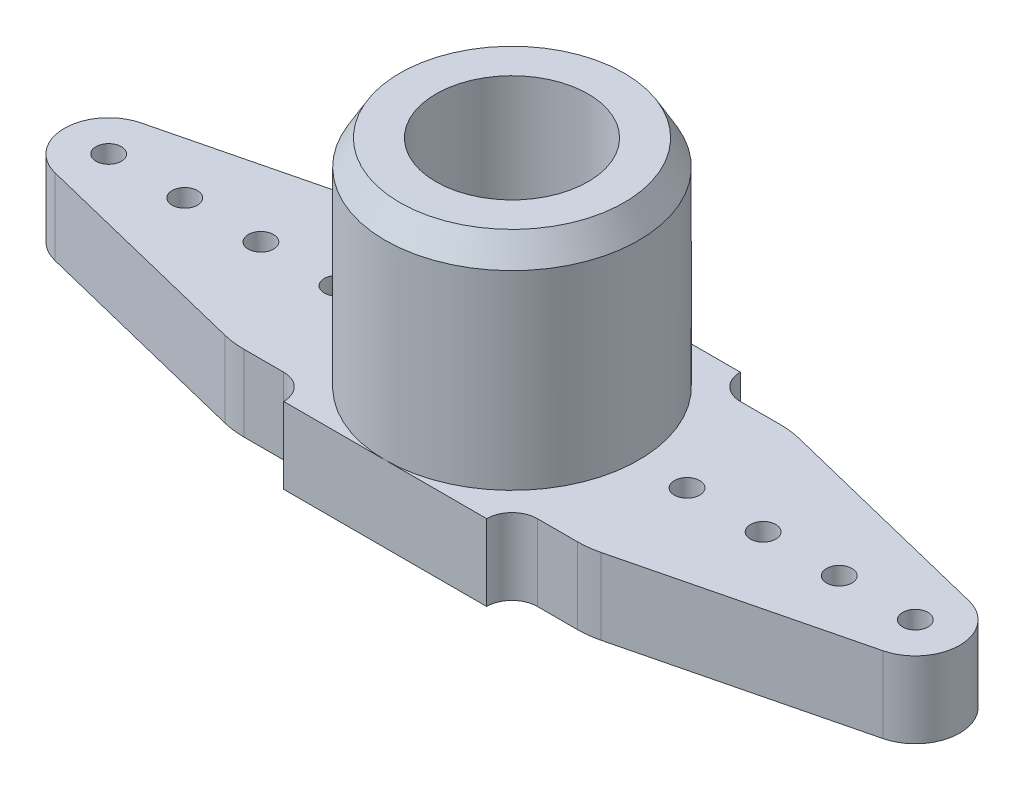
ISO-10303-21;
HEADER;
FILE_DESCRIPTION(('STEP AP214'),'2;1');
FILE_NAME('part.step','',(''),(''),'','','');
FILE_SCHEMA(('AUTOMOTIVE_DESIGN { 1 0 10303 214 1 1 1 1 }'));
ENDSEC;
DATA;
#1=APPLICATION_CONTEXT('core data for automotive mechanical design processes');
#2=APPLICATION_PROTOCOL_DEFINITION('international standard','automotive_design',2000,#1);
#3=PRODUCT_CONTEXT('',#1,'mechanical');
#4=PRODUCT('Part','Part','',(#3));
#5=PRODUCT_RELATED_PRODUCT_CATEGORY('part','',(#4));
#6=PRODUCT_DEFINITION_FORMATION('','',#4);
#7=PRODUCT_DEFINITION_CONTEXT('part definition',#1,'design');
#8=PRODUCT_DEFINITION('design','',#6,#7);
#9=PRODUCT_DEFINITION_SHAPE('','',#8);
#10=(LENGTH_UNIT() NAMED_UNIT(*) SI_UNIT(.MILLI.,.METRE.));
#11=(NAMED_UNIT(*) PLANE_ANGLE_UNIT() SI_UNIT($,.RADIAN.));
#12=(NAMED_UNIT(*) SI_UNIT($,.STERADIAN.) SOLID_ANGLE_UNIT());
#13=UNCERTAINTY_MEASURE_WITH_UNIT(LENGTH_MEASURE(1.E-05),#10,'distance_accuracy_value','');
#14=(GEOMETRIC_REPRESENTATION_CONTEXT(3) GLOBAL_UNCERTAINTY_ASSIGNED_CONTEXT((#13)) GLOBAL_UNIT_ASSIGNED_CONTEXT((#10,
#11,#12)) REPRESENTATION_CONTEXT('',''));
#15=CARTESIAN_POINT('',(0.,0.,0.));
#16=DIRECTION('',(0.,0.,1.));
#17=DIRECTION('',(1.,0.,0.));
#18=AXIS2_PLACEMENT_3D('',#15,#16,#17);
#19=CARTESIAN_POINT('',(0.,3.,0.));
#20=DIRECTION('',(0.,1.,0.));
#21=DIRECTION('',(0.,0.,1.));
#22=AXIS2_PLACEMENT_3D('',#19,#20,#21);
#23=PLANE('',#22);
#24=DIRECTION('',(1.,0.,0.));
#25=VECTOR('',#24,1.);
#26=CARTESIAN_POINT('',(0.,3.,-4.99999999999992));
#27=LINE('',#26,#25);
#28=CARTESIAN_POINT('',(-3.99999999999998,3.,-4.99999999999991));
#29=VERTEX_POINT('',#28);
#30=CARTESIAN_POINT('',(0.,3.,-4.99999999999992));
#31=VERTEX_POINT('',#30);
#32=EDGE_CURVE('E907',#29,#31,#27,.T.);
#33=ORIENTED_EDGE('',*,*,#32,.F.);
#34=CARTESIAN_POINT('',(-5.,3.,-5.00000000000002));
#35=DIRECTION('',(0.,1.,0.));
#36=DIRECTION('',(0.,0.,1.));
#37=AXIS2_PLACEMENT_3D('',#34,#35,#36);
#38=CIRCLE('',#37,1.);
#39=CARTESIAN_POINT('',(-5.00000000000001,3.,-4.00000000000002));
#40=VERTEX_POINT('',#39);
#41=EDGE_CURVE('E204',#29,#40,#38,.F.);
#42=ORIENTED_EDGE('',*,*,#41,.T.);
#43=DIRECTION('',(-1.,0.,0.));
#44=VECTOR('',#43,1.);
#45=CARTESIAN_POINT('',(0.,3.,-4.));
#46=LINE('',#45,#44);
#47=CARTESIAN_POINT('',(-6.57429368146865,3.,-4.00000000000007));
#48=VERTEX_POINT('',#47);
#49=EDGE_CURVE('E327',#40,#48,#46,.T.);
#50=ORIENTED_EDGE('',*,*,#49,.T.);
#51=CARTESIAN_POINT('',(-6.57429368146869,3.,-0.500000000000069));
#52=DIRECTION('',(0.,1.,0.));
#53=DIRECTION('',(-1.,0.,0.));
#54=AXIS2_PLACEMENT_3D('',#51,#52,#53);
#55=CIRCLE('',#54,3.5);
#56=CARTESIAN_POINT('',(-7.41329418820799,3.,-3.89795205229439));
#57=VERTEX_POINT('',#56);
#58=EDGE_CURVE('E233',#48,#57,#55,.T.);
#59=ORIENTED_EDGE('',*,*,#58,.T.);
#60=DIRECTION('',(-0.970843443512664,0.,0.239714430496943));
#61=VECTOR('',#60,1.);
#62=CARTESIAN_POINT('',(-16.319147094104,3.,-1.69897602614733));
#63=LINE('',#62,#61);
#64=CARTESIAN_POINT('',(-16.319147094104,3.,-1.69897602614733));
#65=VERTEX_POINT('',#64);
#66=EDGE_CURVE('E878',#57,#65,#63,.T.);
#67=ORIENTED_EDGE('',*,*,#66,.T.);
#68=CARTESIAN_POINT('',(-15.8996468407343,3.,-1.6653996071586E-13));
#69=DIRECTION('',(0.,1.,0.));
#70=DIRECTION('',(-1.,0.,0.));
#71=AXIS2_PLACEMENT_3D('',#68,#69,#70);
#72=CIRCLE('',#71,1.75);
#73=CARTESIAN_POINT('',(-16.319147094104,3.,1.69897602614699));
#74=VERTEX_POINT('',#73);
#75=EDGE_CURVE('E868',#65,#74,#72,.T.);
#76=ORIENTED_EDGE('',*,*,#75,.T.);
#77=DIRECTION('',(0.970843443512658,0.,0.239714430496963));
#78=VECTOR('',#77,1.);
#79=CARTESIAN_POINT('',(-7.41329418820807,3.,3.89795205229424));
#80=LINE('',#79,#78);
#81=CARTESIAN_POINT('',(-7.41329418820807,3.,3.89795205229424));
#82=VERTEX_POINT('',#81);
#83=EDGE_CURVE('E874',#74,#82,#80,.T.);
#84=ORIENTED_EDGE('',*,*,#83,.T.);
#85=CARTESIAN_POINT('',(-6.5742936814687,3.,0.499999999999931));
#86=DIRECTION('',(0.,1.,0.));
#87=DIRECTION('',(-1.,0.,0.));
#88=AXIS2_PLACEMENT_3D('',#85,#86,#87);
#89=CIRCLE('',#88,3.5);
#90=CARTESIAN_POINT('',(-6.57429368146873,3.,3.99999999999993));
#91=VERTEX_POINT('',#90);
#92=EDGE_CURVE('E873',#82,#91,#89,.T.);
#93=ORIENTED_EDGE('',*,*,#92,.T.);
#94=DIRECTION('',(1.,0.,0.));
#95=VECTOR('',#94,1.);
#96=CARTESIAN_POINT('',(0.,3.,4.));
#97=LINE('',#96,#95);
#98=CARTESIAN_POINT('',(-4.99999999999999,3.,3.99999999999995));
#99=VERTEX_POINT('',#98);
#100=EDGE_CURVE('E346',#91,#99,#97,.T.);
#101=ORIENTED_EDGE('',*,*,#100,.T.);
#102=CARTESIAN_POINT('',(-5.,3.,4.99999999999995));
#103=DIRECTION('',(0.,1.,0.));
#104=DIRECTION('',(0.,0.,1.));
#105=AXIS2_PLACEMENT_3D('',#102,#103,#104);
#106=CIRCLE('',#105,1.);
#107=CARTESIAN_POINT('',(-4.,3.,4.99999999999995));
#108=VERTEX_POINT('',#107);
#109=EDGE_CURVE('E210',#99,#108,#106,.F.);
#110=ORIENTED_EDGE('',*,*,#109,.T.);
#111=DIRECTION('',(-1.,0.,0.));
#112=VECTOR('',#111,1.);
#113=CARTESIAN_POINT('',(0.,3.,4.99999999999998));
#114=LINE('',#113,#112);
#115=CARTESIAN_POINT('',(0.,3.,4.99999999999998));
#116=VERTEX_POINT('',#115);
#117=EDGE_CURVE('E258',#116,#108,#114,.T.);
#118=ORIENTED_EDGE('',*,*,#117,.F.);
#119=CARTESIAN_POINT('',(0.,3.,0.));
#120=DIRECTION('',(0.,1.,0.));
#121=DIRECTION('',(0.,0.,1.));
#122=AXIS2_PLACEMENT_3D('',#119,#120,#121);
#123=CIRCLE('',#122,5.);
#124=EDGE_CURVE('E902',#31,#116,#123,.T.);
#125=ORIENTED_EDGE('',*,*,#124,.F.);
#126=EDGE_LOOP('',(#33,#42,#50,#59,#67,#76,#84,#93,#101,#110,#118,#125));
#127=FACE_BOUND('',#126,.T.);
#128=CARTESIAN_POINT('',(-9.89964684073435,3.,-1.6653996071586E-13));
#129=DIRECTION('',(0.,1.,0.));
#130=DIRECTION('',(1.,0.,0.));
#131=AXIS2_PLACEMENT_3D('',#128,#129,#130);
#132=CIRCLE('',#131,0.500000000000001);
#133=CARTESIAN_POINT('',(-9.39964684073435,3.,-1.61302738707596E-13));
#134=VERTEX_POINT('',#133);
#135=EDGE_CURVE('E887',#134,#134,#132,.T.);
#136=ORIENTED_EDGE('',*,*,#135,.F.);
#137=EDGE_LOOP('',(#136));
#138=FACE_BOUND('',#137,.T.);
#139=CARTESIAN_POINT('',(-15.8996468407343,3.,-1.6653996071586E-13));
#140=DIRECTION('',(0.,1.,0.));
#141=DIRECTION('',(1.,0.,0.));
#142=AXIS2_PLACEMENT_3D('',#139,#140,#141);
#143=CIRCLE('',#142,0.500000000000001);
#144=CARTESIAN_POINT('',(-15.3996468407343,3.,-1.61302738707596E-13));
#145=VERTEX_POINT('',#144);
#146=EDGE_CURVE('E338',#145,#145,#143,.T.);
#147=ORIENTED_EDGE('',*,*,#146,.F.);
#148=EDGE_LOOP('',(#147));
#149=FACE_BOUND('',#148,.T.);
#150=CARTESIAN_POINT('',(-12.8996468407343,3.,-1.6653996071586E-13));
#151=DIRECTION('',(0.,1.,0.));
#152=DIRECTION('',(1.,0.,0.));
#153=AXIS2_PLACEMENT_3D('',#150,#151,#152);
#154=CIRCLE('',#153,0.500000000000001);
#155=CARTESIAN_POINT('',(-12.3996468407343,3.,-1.61302738707596E-13));
#156=VERTEX_POINT('',#155);
#157=EDGE_CURVE('E882',#156,#156,#154,.T.);
#158=ORIENTED_EDGE('',*,*,#157,.F.);
#159=EDGE_LOOP('',(#158));
#160=FACE_BOUND('',#159,.T.);
#161=CARTESIAN_POINT('',(-6.89964684073435,3.,-1.6653996071586E-13));
#162=DIRECTION('',(0.,1.,0.));
#163=DIRECTION('',(1.,0.,0.));
#164=AXIS2_PLACEMENT_3D('',#161,#162,#163);
#165=CIRCLE('',#164,0.500000000000001);
#166=CARTESIAN_POINT('',(-6.39964684073434,3.,-1.61302738707596E-13));
#167=VERTEX_POINT('',#166);
#168=EDGE_CURVE('E893',#167,#167,#165,.T.);
#169=ORIENTED_EDGE('',*,*,#168,.F.);
#170=EDGE_LOOP('',(#169));
#171=FACE_BOUND('',#170,.T.);
#172=ADVANCED_FACE('F34',(#127,#138,#149,#160,#171),#23,.T.);
#173=CARTESIAN_POINT('',(4.,3.,-4.99999999999994));
#174=VERTEX_POINT('',#173);
#175=EDGE_CURVE('E182',#31,#174,#27,.T.);
#176=ORIENTED_EDGE('',*,*,#175,.F.);
#177=EDGE_CURVE('E257',#116,#31,#123,.T.);
#178=ORIENTED_EDGE('',*,*,#177,.F.);
#179=CARTESIAN_POINT('',(4.,3.,5.00000000000002));
#180=VERTEX_POINT('',#179);
#181=EDGE_CURVE('E249',#180,#116,#114,.T.);
#182=ORIENTED_EDGE('',*,*,#181,.F.);
#183=CARTESIAN_POINT('',(5.,3.,5.00000000000002));
#184=DIRECTION('',(0.,1.,0.));
#185=DIRECTION('',(0.,0.,1.));
#186=AXIS2_PLACEMENT_3D('',#183,#184,#185);
#187=CIRCLE('',#186,1.);
#188=CARTESIAN_POINT('',(5.00000000000001,3.,4.00000000000002));
#189=VERTEX_POINT('',#188);
#190=EDGE_CURVE('E42',#180,#189,#187,.F.);
#191=ORIENTED_EDGE('',*,*,#190,.T.);
#192=DIRECTION('',(1.,0.,0.));
#193=VECTOR('',#192,1.);
#194=CARTESIAN_POINT('',(6.57429368146868,3.,4.00000000000002));
#195=LINE('',#194,#193);
#196=CARTESIAN_POINT('',(6.57429368146868,3.,4.00000000000002));
#197=VERTEX_POINT('',#196);
#198=EDGE_CURVE('E287',#189,#197,#195,.T.);
#199=ORIENTED_EDGE('',*,*,#198,.T.);
#200=CARTESIAN_POINT('',(6.57429368146869,3.,0.500000000000023));
#201=DIRECTION('',(0.,1.,0.));
#202=DIRECTION('',(1.,0.,0.));
#203=AXIS2_PLACEMENT_3D('',#200,#201,#202);
#204=CIRCLE('',#203,3.5);
#205=CARTESIAN_POINT('',(7.41329418820801,3.,3.89795205229434));
#206=VERTEX_POINT('',#205);
#207=EDGE_CURVE('E388',#197,#206,#204,.T.);
#208=ORIENTED_EDGE('',*,*,#207,.T.);
#209=DIRECTION('',(0.970843443512662,0.,-0.23971443049695));
#210=VECTOR('',#209,1.);
#211=CARTESIAN_POINT('',(16.319147094104,3.,1.69897602614721));
#212=LINE('',#211,#210);
#213=CARTESIAN_POINT('',(16.319147094104,3.,1.69897602614721));
#214=VERTEX_POINT('',#213);
#215=EDGE_CURVE('E390',#206,#214,#212,.T.);
#216=ORIENTED_EDGE('',*,*,#215,.T.);
#217=CARTESIAN_POINT('',(15.8996468407343,3.,0.));
#218=DIRECTION('',(0.,1.,0.));
#219=DIRECTION('',(1.,0.,0.));
#220=AXIS2_PLACEMENT_3D('',#217,#218,#219);
#221=CIRCLE('',#220,1.75);
#222=CARTESIAN_POINT('',(16.319147094104,3.,-1.6989760261471));
#223=VERTEX_POINT('',#222);
#224=EDGE_CURVE('E392',#214,#223,#221,.T.);
#225=ORIENTED_EDGE('',*,*,#224,.T.);
#226=DIRECTION('',(-0.97084344351266,0.,-0.239714430496957));
#227=VECTOR('',#226,1.);
#228=CARTESIAN_POINT('',(7.41329418820804,3.,-3.89795205229429));
#229=LINE('',#228,#227);
#230=CARTESIAN_POINT('',(7.41329418820804,3.,-3.89795205229429));
#231=VERTEX_POINT('',#230);
#232=EDGE_CURVE('E394',#223,#231,#229,.T.);
#233=ORIENTED_EDGE('',*,*,#232,.T.);
#234=CARTESIAN_POINT('',(6.57429368146869,3.,-0.499999999999977));
#235=DIRECTION('',(0.,1.,0.));
#236=DIRECTION('',(1.,0.,0.));
#237=AXIS2_PLACEMENT_3D('',#234,#235,#236);
#238=CIRCLE('',#237,3.5);
#239=CARTESIAN_POINT('',(6.5742936814687,3.,-3.99999999999998));
#240=VERTEX_POINT('',#239);
#241=EDGE_CURVE('E395',#231,#240,#238,.T.);
#242=ORIENTED_EDGE('',*,*,#241,.T.);
#243=CARTESIAN_POINT('',(5.,3.,-3.99999999999998));
#244=VERTEX_POINT('',#243);
#245=EDGE_CURVE('E274',#240,#244,#46,.T.);
#246=ORIENTED_EDGE('',*,*,#245,.T.);
#247=CARTESIAN_POINT('',(5.,3.,-4.99999999999998));
#248=DIRECTION('',(0.,1.,0.));
#249=DIRECTION('',(0.,0.,1.));
#250=AXIS2_PLACEMENT_3D('',#247,#248,#249);
#251=CIRCLE('',#250,1.);
#252=EDGE_CURVE('E202',#244,#174,#251,.F.);
#253=ORIENTED_EDGE('',*,*,#252,.T.);
#254=EDGE_LOOP('',(#176,#178,#182,#191,#199,#208,#216,#225,#233,#242,#246,#253));
#255=FACE_BOUND('',#254,.T.);
#256=CARTESIAN_POINT('',(6.89964684073435,3.,1.18359984337797E-13));
#257=DIRECTION('',(0.,1.,0.));
#258=DIRECTION('',(-1.,0.,0.));
#259=AXIS2_PLACEMENT_3D('',#256,#257,#258);
#260=CIRCLE('',#259,0.500000000000001);
#261=CARTESIAN_POINT('',(6.39964684073434,3.,1.16614243668375E-13));
#262=VERTEX_POINT('',#261);
#263=EDGE_CURVE('E368',#262,#262,#260,.T.);
#264=ORIENTED_EDGE('',*,*,#263,.F.);
#265=EDGE_LOOP('',(#264));
#266=FACE_BOUND('',#265,.T.);
#267=CARTESIAN_POINT('',(12.8996468407343,3.,0.));
#268=DIRECTION('',(0.,1.,0.));
#269=DIRECTION('',(-1.,0.,0.));
#270=AXIS2_PLACEMENT_3D('',#267,#268,#269);
#271=CIRCLE('',#270,0.500000000000001);
#272=CARTESIAN_POINT('',(12.3996468407343,3.,0.));
#273=VERTEX_POINT('',#272);
#274=EDGE_CURVE('E380',#273,#273,#271,.T.);
#275=ORIENTED_EDGE('',*,*,#274,.F.);
#276=EDGE_LOOP('',(#275));
#277=FACE_BOUND('',#276,.T.);
#278=CARTESIAN_POINT('',(15.8996468407343,3.,0.));
#279=DIRECTION('',(0.,1.,0.));
#280=DIRECTION('',(-1.,0.,0.));
#281=AXIS2_PLACEMENT_3D('',#278,#279,#280);
#282=CIRCLE('',#281,0.500000000000001);
#283=CARTESIAN_POINT('',(15.3996468407343,3.,0.));
#284=VERTEX_POINT('',#283);
#285=EDGE_CURVE('E266',#284,#284,#282,.T.);
#286=ORIENTED_EDGE('',*,*,#285,.F.);
#287=EDGE_LOOP('',(#286));
#288=FACE_BOUND('',#287,.T.);
#289=CARTESIAN_POINT('',(9.89964684073435,3.,0.));
#290=DIRECTION('',(0.,1.,0.));
#291=DIRECTION('',(-1.,0.,0.));
#292=AXIS2_PLACEMENT_3D('',#289,#290,#291);
#293=CIRCLE('',#292,0.500000000000001);
#294=CARTESIAN_POINT('',(9.39964684073435,3.,0.));
#295=VERTEX_POINT('',#294);
#296=EDGE_CURVE('E374',#295,#295,#293,.T.);
#297=ORIENTED_EDGE('',*,*,#296,.F.);
#298=EDGE_LOOP('',(#297));
#299=FACE_BOUND('',#298,.T.);
#300=ADVANCED_FACE('F254',(#255,#266,#277,#288,#299),#23,.T.);
#301=CARTESIAN_POINT('',(0.,3.,0.));
#302=DIRECTION('',(0.,1.,0.));
#303=DIRECTION('',(0.,0.,1.));
#304=AXIS2_PLACEMENT_3D('',#301,#302,#303);
#305=CIRCLE('',#304,3.);
#306=CARTESIAN_POINT('',(0.,3.,3.));
#307=VERTEX_POINT('',#306);
#308=EDGE_CURVE('E309',#307,#307,#305,.F.);
#309=ORIENTED_EDGE('',*,*,#308,.F.);
#310=EDGE_LOOP('',(#309));
#311=FACE_BOUND('',#310,.T.);
#312=CARTESIAN_POINT('',(0.,3.,0.));
#313=DIRECTION('',(0.,-1.,0.));
#314=DIRECTION('',(0.,0.,1.));
#315=AXIS2_PLACEMENT_3D('',#312,#313,#314);
#316=CIRCLE('',#315,1.25);
#317=CARTESIAN_POINT('',(0.,3.,1.25));
#318=VERTEX_POINT('',#317);
#319=EDGE_CURVE('E306',#318,#318,#316,.T.);
#320=ORIENTED_EDGE('',*,*,#319,.T.);
#321=EDGE_LOOP('',(#320));
#322=FACE_BOUND('',#321,.T.);
#323=ADVANCED_FACE('F435',(#311,#322),#23,.T.);
#324=CARTESIAN_POINT('',(0.,0.,0.));
#325=DIRECTION('',(0.,1.,0.));
#326=DIRECTION('',(0.,0.,1.));
#327=AXIS2_PLACEMENT_3D('',#324,#325,#326);
#328=PLANE('',#327);
#329=CARTESIAN_POINT('',(0.,0.,0.));
#330=DIRECTION('',(0.,-1.,0.));
#331=DIRECTION('',(0.,0.,1.));
#332=AXIS2_PLACEMENT_3D('',#329,#330,#331);
#333=CIRCLE('',#332,1.25);
#334=CARTESIAN_POINT('',(0.,0.,1.25));
#335=VERTEX_POINT('',#334);
#336=EDGE_CURVE('E305',#335,#335,#333,.T.);
#337=ORIENTED_EDGE('',*,*,#336,.F.);
#338=EDGE_LOOP('',(#337));
#339=FACE_BOUND('',#338,.T.);
#340=CARTESIAN_POINT('',(-5.,0.,-5.00000000000002));
#341=DIRECTION('',(0.,1.,0.));
#342=DIRECTION('',(0.,0.,1.));
#343=AXIS2_PLACEMENT_3D('',#340,#341,#342);
#344=CIRCLE('',#343,1.);
#345=CARTESIAN_POINT('',(-5.00000000000001,0.,-4.00000000000002));
#346=VERTEX_POINT('',#345);
#347=CARTESIAN_POINT('',(-4.,0.,-5.00000000000002));
#348=VERTEX_POINT('',#347);
#349=EDGE_CURVE('E196',#346,#348,#344,.T.);
#350=ORIENTED_EDGE('',*,*,#349,.T.);
#351=DIRECTION('',(-1.,0.,0.));
#352=VECTOR('',#351,1.);
#353=CARTESIAN_POINT('',(4.00000000000002,0.,-4.99999999999994));
#354=LINE('',#353,#352);
#355=CARTESIAN_POINT('',(4.,0.,-4.99999999999994));
#356=VERTEX_POINT('',#355);
#357=EDGE_CURVE('E179',#356,#348,#354,.T.);
#358=ORIENTED_EDGE('',*,*,#357,.F.);
#359=CARTESIAN_POINT('',(5.,0.,-4.99999999999998));
#360=DIRECTION('',(0.,1.,0.));
#361=DIRECTION('',(0.,0.,1.));
#362=AXIS2_PLACEMENT_3D('',#359,#360,#361);
#363=CIRCLE('',#362,1.);
#364=CARTESIAN_POINT('',(5.,0.,-3.99999999999998));
#365=VERTEX_POINT('',#364);
#366=EDGE_CURVE('E193',#356,#365,#363,.T.);
#367=ORIENTED_EDGE('',*,*,#366,.T.);
#368=DIRECTION('',(-1.,0.,0.));
#369=VECTOR('',#368,1.);
#370=CARTESIAN_POINT('',(0.,0.,-4.));
#371=LINE('',#370,#369);
#372=CARTESIAN_POINT('',(6.5742936814687,0.,-3.99999999999998));
#373=VERTEX_POINT('',#372);
#374=EDGE_CURVE('E285',#373,#365,#371,.T.);
#375=ORIENTED_EDGE('',*,*,#374,.F.);
#376=CARTESIAN_POINT('',(6.57429368146869,0.,-0.499999999999977));
#377=DIRECTION('',(0.,1.,0.));
#378=DIRECTION('',(1.,0.,0.));
#379=AXIS2_PLACEMENT_3D('',#376,#377,#378);
#380=CIRCLE('',#379,3.5);
#381=CARTESIAN_POINT('',(7.41329418820804,0.,-3.89795205229429));
#382=VERTEX_POINT('',#381);
#383=EDGE_CURVE('E282',#382,#373,#380,.T.);
#384=ORIENTED_EDGE('',*,*,#383,.F.);
#385=DIRECTION('',(-0.97084344351266,0.,-0.239714430496957));
#386=VECTOR('',#385,1.);
#387=CARTESIAN_POINT('',(7.41329418820804,0.,-3.89795205229429));
#388=LINE('',#387,#386);
#389=CARTESIAN_POINT('',(16.319147094104,0.,-1.6989760261471));
#390=VERTEX_POINT('',#389);
#391=EDGE_CURVE('E280',#390,#382,#388,.T.);
#392=ORIENTED_EDGE('',*,*,#391,.F.);
#393=CARTESIAN_POINT('',(15.8996468407343,0.,0.));
#394=DIRECTION('',(0.,1.,0.));
#395=DIRECTION('',(1.,0.,0.));
#396=AXIS2_PLACEMENT_3D('',#393,#394,#395);
#397=CIRCLE('',#396,1.75);
#398=CARTESIAN_POINT('',(16.319147094104,0.,1.69897602614721));
#399=VERTEX_POINT('',#398);
#400=EDGE_CURVE('E278',#399,#390,#397,.T.);
#401=ORIENTED_EDGE('',*,*,#400,.F.);
#402=DIRECTION('',(0.970843443512662,0.,-0.23971443049695));
#403=VECTOR('',#402,1.);
#404=CARTESIAN_POINT('',(16.319147094104,0.,1.69897602614721));
#405=LINE('',#404,#403);
#406=CARTESIAN_POINT('',(7.41329418820801,0.,3.89795205229434));
#407=VERTEX_POINT('',#406);
#408=EDGE_CURVE('E268',#407,#399,#405,.T.);
#409=ORIENTED_EDGE('',*,*,#408,.F.);
#410=CARTESIAN_POINT('',(6.57429368146869,0.,0.500000000000023));
#411=DIRECTION('',(0.,1.,0.));
#412=DIRECTION('',(1.,0.,0.));
#413=AXIS2_PLACEMENT_3D('',#410,#411,#412);
#414=CIRCLE('',#413,3.5);
#415=CARTESIAN_POINT('',(6.57429368146868,0.,4.00000000000002));
#416=VERTEX_POINT('',#415);
#417=EDGE_CURVE('E263',#416,#407,#414,.T.);
#418=ORIENTED_EDGE('',*,*,#417,.F.);
#419=DIRECTION('',(1.,0.,0.));
#420=VECTOR('',#419,1.);
#421=CARTESIAN_POINT('',(6.57429368146868,0.,4.00000000000002));
#422=LINE('',#421,#420);
#423=CARTESIAN_POINT('',(5.00000000000001,0.,4.00000000000002));
#424=VERTEX_POINT('',#423);
#425=EDGE_CURVE('E261',#424,#416,#422,.T.);
#426=ORIENTED_EDGE('',*,*,#425,.F.);
#427=CARTESIAN_POINT('',(5.,0.,5.00000000000002));
#428=DIRECTION('',(0.,1.,0.));
#429=DIRECTION('',(0.,0.,1.));
#430=AXIS2_PLACEMENT_3D('',#427,#428,#429);
#431=CIRCLE('',#430,1.);
#432=CARTESIAN_POINT('',(4.,0.,5.00000000000002));
#433=VERTEX_POINT('',#432);
#434=EDGE_CURVE('E11',#424,#433,#431,.T.);
#435=ORIENTED_EDGE('',*,*,#434,.T.);
#436=DIRECTION('',(1.,0.,0.));
#437=VECTOR('',#436,1.);
#438=CARTESIAN_POINT('',(4.,0.,5.00000000000002));
#439=LINE('',#438,#437);
#440=CARTESIAN_POINT('',(-4.,0.,4.99999999999995));
#441=VERTEX_POINT('',#440);
#442=EDGE_CURVE('E220',#441,#433,#439,.T.);
#443=ORIENTED_EDGE('',*,*,#442,.F.);
#444=CARTESIAN_POINT('',(-5.,0.,4.99999999999995));
#445=DIRECTION('',(0.,1.,0.));
#446=DIRECTION('',(0.,0.,1.));
#447=AXIS2_PLACEMENT_3D('',#444,#445,#446);
#448=CIRCLE('',#447,1.);
#449=CARTESIAN_POINT('',(-4.99999999999999,0.,3.99999999999995));
#450=VERTEX_POINT('',#449);
#451=EDGE_CURVE('E213',#441,#450,#448,.T.);
#452=ORIENTED_EDGE('',*,*,#451,.T.);
#453=DIRECTION('',(1.,0.,0.));
#454=VECTOR('',#453,1.);
#455=CARTESIAN_POINT('',(0.,0.,4.));
#456=LINE('',#455,#454);
#457=CARTESIAN_POINT('',(-6.57429368146873,0.,3.99999999999993));
#458=VERTEX_POINT('',#457);
#459=EDGE_CURVE('E219',#458,#450,#456,.T.);
#460=ORIENTED_EDGE('',*,*,#459,.F.);
#461=CARTESIAN_POINT('',(-6.5742936814687,0.,0.499999999999931));
#462=DIRECTION('',(0.,1.,0.));
#463=DIRECTION('',(-1.,0.,0.));
#464=AXIS2_PLACEMENT_3D('',#461,#462,#463);
#465=CIRCLE('',#464,3.5);
#466=CARTESIAN_POINT('',(-7.41329418820807,0.,3.89795205229424));
#467=VERTEX_POINT('',#466);
#468=EDGE_CURVE('E234',#467,#458,#465,.T.);
#469=ORIENTED_EDGE('',*,*,#468,.F.);
#470=DIRECTION('',(0.970843443512658,0.,0.239714430496963));
#471=VECTOR('',#470,1.);
#472=CARTESIAN_POINT('',(-7.41329418820807,0.,3.89795205229424));
#473=LINE('',#472,#471);
#474=CARTESIAN_POINT('',(-16.319147094104,0.,1.69897602614699));
#475=VERTEX_POINT('',#474);
#476=EDGE_CURVE('E350',#475,#467,#473,.T.);
#477=ORIENTED_EDGE('',*,*,#476,.F.);
#478=CARTESIAN_POINT('',(-15.8996468407343,0.,-1.6653996071586E-13));
#479=DIRECTION('',(0.,1.,0.));
#480=DIRECTION('',(-1.,0.,0.));
#481=AXIS2_PLACEMENT_3D('',#478,#479,#480);
#482=CIRCLE('',#481,1.75);
#483=CARTESIAN_POINT('',(-16.319147094104,0.,-1.69897602614733));
#484=VERTEX_POINT('',#483);
#485=EDGE_CURVE('E340',#484,#475,#482,.T.);
#486=ORIENTED_EDGE('',*,*,#485,.F.);
#487=DIRECTION('',(-0.970843443512664,0.,0.239714430496943));
#488=VECTOR('',#487,1.);
#489=CARTESIAN_POINT('',(-16.319147094104,0.,-1.69897602614733));
#490=LINE('',#489,#488);
#491=CARTESIAN_POINT('',(-7.41329418820799,0.,-3.89795205229439));
#492=VERTEX_POINT('',#491);
#493=EDGE_CURVE('E334',#492,#484,#490,.T.);
#494=ORIENTED_EDGE('',*,*,#493,.F.);
#495=CARTESIAN_POINT('',(-6.57429368146869,0.,-0.500000000000069));
#496=DIRECTION('',(0.,1.,0.));
#497=DIRECTION('',(-1.,0.,0.));
#498=AXIS2_PLACEMENT_3D('',#495,#496,#497);
#499=CIRCLE('',#498,3.5);
#500=CARTESIAN_POINT('',(-6.57429368146865,0.,-4.00000000000007));
#501=VERTEX_POINT('',#500);
#502=EDGE_CURVE('E332',#501,#492,#499,.T.);
#503=ORIENTED_EDGE('',*,*,#502,.F.);
#504=EDGE_CURVE('E284',#346,#501,#371,.T.);
#505=ORIENTED_EDGE('',*,*,#504,.F.);
#506=EDGE_LOOP('',(#350,#358,#367,#375,#384,#392,#401,#409,#418,#426,#435,#443,#452,#460,#469,
#477,#486,#494,#503,#505));
#507=FACE_BOUND('',#506,.T.);
#508=CARTESIAN_POINT('',(-15.8996468407343,0.,-1.6653996071586E-13));
#509=DIRECTION('',(0.,1.,0.));
#510=DIRECTION('',(1.,0.,0.));
#511=AXIS2_PLACEMENT_3D('',#508,#509,#510);
#512=CIRCLE('',#511,0.500000000000001);
#513=CARTESIAN_POINT('',(-15.3996468407343,0.,-1.61302738707596E-13));
#514=VERTEX_POINT('',#513);
#515=EDGE_CURVE('E343',#514,#514,#512,.T.);
#516=ORIENTED_EDGE('',*,*,#515,.T.);
#517=EDGE_LOOP('',(#516));
#518=FACE_BOUND('',#517,.T.);
#519=CARTESIAN_POINT('',(-12.8996468407343,0.,-1.6653996071586E-13));
#520=DIRECTION('',(0.,1.,0.));
#521=DIRECTION('',(1.,0.,0.));
#522=AXIS2_PLACEMENT_3D('',#519,#520,#521);
#523=CIRCLE('',#522,0.500000000000001);
#524=CARTESIAN_POINT('',(-12.3996468407343,0.,-1.61302738707596E-13));
#525=VERTEX_POINT('',#524);
#526=EDGE_CURVE('E884',#525,#525,#523,.T.);
#527=ORIENTED_EDGE('',*,*,#526,.T.);
#528=EDGE_LOOP('',(#527));
#529=FACE_BOUND('',#528,.T.);
#530=CARTESIAN_POINT('',(-9.89964684073435,0.,-1.6653996071586E-13));
#531=DIRECTION('',(0.,1.,0.));
#532=DIRECTION('',(1.,0.,0.));
#533=AXIS2_PLACEMENT_3D('',#530,#531,#532);
#534=CIRCLE('',#533,0.500000000000001);
#535=CARTESIAN_POINT('',(-9.39964684073435,0.,-1.61302738707596E-13));
#536=VERTEX_POINT('',#535);
#537=EDGE_CURVE('E890',#536,#536,#534,.T.);
#538=ORIENTED_EDGE('',*,*,#537,.T.);
#539=EDGE_LOOP('',(#538));
#540=FACE_BOUND('',#539,.T.);
#541=CARTESIAN_POINT('',(-6.89964684073435,0.,-1.6653996071586E-13));
#542=DIRECTION('',(0.,1.,0.));
#543=DIRECTION('',(1.,0.,0.));
#544=AXIS2_PLACEMENT_3D('',#541,#542,#543);
#545=CIRCLE('',#544,0.500000000000001);
#546=CARTESIAN_POINT('',(-6.39964684073434,0.,-1.61302738707596E-13));
#547=VERTEX_POINT('',#546);
#548=EDGE_CURVE('E896',#547,#547,#545,.T.);
#549=ORIENTED_EDGE('',*,*,#548,.T.);
#550=EDGE_LOOP('',(#549));
#551=FACE_BOUND('',#550,.T.);
#552=CARTESIAN_POINT('',(6.89964684073435,0.,1.18359984337797E-13));
#553=DIRECTION('',(0.,1.,0.));
#554=DIRECTION('',(-1.,0.,0.));
#555=AXIS2_PLACEMENT_3D('',#552,#553,#554);
#556=CIRCLE('',#555,0.500000000000001);
#557=CARTESIAN_POINT('',(6.39964684073434,0.,1.16614243668375E-13));
#558=VERTEX_POINT('',#557);
#559=EDGE_CURVE('E367',#558,#558,#556,.T.);
#560=ORIENTED_EDGE('',*,*,#559,.T.);
#561=EDGE_LOOP('',(#560));
#562=FACE_BOUND('',#561,.T.);
#563=CARTESIAN_POINT('',(9.89964684073435,0.,0.));
#564=DIRECTION('',(0.,1.,0.));
#565=DIRECTION('',(-1.,0.,0.));
#566=AXIS2_PLACEMENT_3D('',#563,#564,#565);
#567=CIRCLE('',#566,0.500000000000001);
#568=CARTESIAN_POINT('',(9.39964684073435,0.,0.));
#569=VERTEX_POINT('',#568);
#570=EDGE_CURVE('E371',#569,#569,#567,.T.);
#571=ORIENTED_EDGE('',*,*,#570,.T.);
#572=EDGE_LOOP('',(#571));
#573=FACE_BOUND('',#572,.T.);
#574=CARTESIAN_POINT('',(12.8996468407343,0.,0.));
#575=DIRECTION('',(0.,1.,0.));
#576=DIRECTION('',(-1.,0.,0.));
#577=AXIS2_PLACEMENT_3D('',#574,#575,#576);
#578=CIRCLE('',#577,0.500000000000001);
#579=CARTESIAN_POINT('',(12.3996468407343,0.,0.));
#580=VERTEX_POINT('',#579);
#581=EDGE_CURVE('E377',#580,#580,#578,.T.);
#582=ORIENTED_EDGE('',*,*,#581,.T.);
#583=EDGE_LOOP('',(#582));
#584=FACE_BOUND('',#583,.T.);
#585=CARTESIAN_POINT('',(15.8996468407343,0.,0.));
#586=DIRECTION('',(0.,1.,0.));
#587=DIRECTION('',(-1.,0.,0.));
#588=AXIS2_PLACEMENT_3D('',#585,#586,#587);
#589=CIRCLE('',#588,0.500000000000001);
#590=CARTESIAN_POINT('',(15.3996468407343,0.,0.));
#591=VERTEX_POINT('',#590);
#592=EDGE_CURVE('E271',#591,#591,#589,.T.);
#593=ORIENTED_EDGE('',*,*,#592,.T.);
#594=EDGE_LOOP('',(#593));
#595=FACE_BOUND('',#594,.T.);
#596=ADVANCED_FACE('F190',(#339,#507,#518,#529,#540,#551,#562,#573,#584,#595),#328,.F.);
#597=CARTESIAN_POINT('',(0.,3.,0.));
#598=DIRECTION('',(0.,-1.,0.));
#599=DIRECTION('',(0.,0.,-1.));
#600=AXIS2_PLACEMENT_3D('',#597,#598,#599);
#601=CYLINDRICAL_SURFACE('',#600,1.25);
#602=ORIENTED_EDGE('',*,*,#336,.T.);
#603=EDGE_LOOP('',(#602));
#604=FACE_BOUND('',#603,.T.);
#605=ORIENTED_EDGE('',*,*,#319,.F.);
#606=EDGE_LOOP('',(#605));
#607=FACE_BOUND('',#606,.T.);
#608=ADVANCED_FACE('F447',(#604,#607),#601,.F.);
#609=CARTESIAN_POINT('',(0.,3.,-4.));
#610=DIRECTION('',(0.,0.,1.));
#611=DIRECTION('',(1.,0.,0.));
#612=AXIS2_PLACEMENT_3D('',#609,#610,#611);
#613=PLANE('',#612);
#614=ORIENTED_EDGE('',*,*,#374,.T.);
#615=DIRECTION('',(0.,1.,0.));
#616=VECTOR('',#615,1.);
#617=CARTESIAN_POINT('',(5.,3.,-3.99999999999998));
#618=LINE('',#617,#616);
#619=EDGE_CURVE('E187',#365,#244,#618,.T.);
#620=ORIENTED_EDGE('',*,*,#619,.T.);
#621=ORIENTED_EDGE('',*,*,#245,.F.);
#622=DIRECTION('',(0.,-1.,0.));
#623=VECTOR('',#622,1.);
#624=CARTESIAN_POINT('',(6.5742936814687,3.,-3.99999999999998));
#625=LINE('',#624,#623);
#626=EDGE_CURVE('E288',#240,#373,#625,.T.);
#627=ORIENTED_EDGE('',*,*,#626,.T.);
#628=EDGE_LOOP('',(#614,#620,#621,#627));
#629=FACE_BOUND('',#628,.T.);
#630=ADVANCED_FACE('F402',(#629),#613,.F.);
#631=ORIENTED_EDGE('',*,*,#49,.F.);
#632=DIRECTION('',(0.,-1.,0.));
#633=VECTOR('',#632,1.);
#634=CARTESIAN_POINT('',(-5.00000000000001,0.,-4.00000000000002));
#635=LINE('',#634,#633);
#636=EDGE_CURVE('E186',#40,#346,#635,.T.);
#637=ORIENTED_EDGE('',*,*,#636,.T.);
#638=ORIENTED_EDGE('',*,*,#504,.T.);
#639=DIRECTION('',(0.,-1.,0.));
#640=VECTOR('',#639,1.);
#641=CARTESIAN_POINT('',(-6.57429368146865,3.,-4.00000000000007));
#642=LINE('',#641,#640);
#643=EDGE_CURVE('E365',#48,#501,#642,.T.);
#644=ORIENTED_EDGE('',*,*,#643,.F.);
#645=EDGE_LOOP('',(#631,#637,#638,#644));
#646=FACE_BOUND('',#645,.T.);
#647=ADVANCED_FACE('F324',(#646),#613,.F.);
#648=CARTESIAN_POINT('',(6.57429368146868,3.,4.00000000000002));
#649=DIRECTION('',(0.,0.,-1.));
#650=DIRECTION('',(-1.,0.,0.));
#651=AXIS2_PLACEMENT_3D('',#648,#649,#650);
#652=PLANE('',#651);
#653=ORIENTED_EDGE('',*,*,#198,.F.);
#654=DIRECTION('',(0.,1.,0.));
#655=VECTOR('',#654,1.);
#656=CARTESIAN_POINT('',(5.00000000000001,0.,4.00000000000002));
#657=LINE('',#656,#655);
#658=EDGE_CURVE('E55',#189,#424,#657,.F.);
#659=ORIENTED_EDGE('',*,*,#658,.T.);
#660=ORIENTED_EDGE('',*,*,#425,.T.);
#661=DIRECTION('',(0.,-1.,0.));
#662=VECTOR('',#661,1.);
#663=CARTESIAN_POINT('',(6.57429368146868,3.,4.00000000000002));
#664=LINE('',#663,#662);
#665=EDGE_CURVE('E303',#197,#416,#664,.T.);
#666=ORIENTED_EDGE('',*,*,#665,.F.);
#667=EDGE_LOOP('',(#653,#659,#660,#666));
#668=FACE_BOUND('',#667,.T.);
#669=ADVANCED_FACE('F424',(#668),#652,.F.);
#670=CARTESIAN_POINT('',(6.57429368146869,3.,0.500000000000023));
#671=DIRECTION('',(0.,-1.,0.));
#672=DIRECTION('',(0.,0.,-1.));
#673=AXIS2_PLACEMENT_3D('',#670,#671,#672);
#674=CYLINDRICAL_SURFACE('',#673,3.5);
#675=ORIENTED_EDGE('',*,*,#417,.T.);
#676=DIRECTION('',(0.,-1.,0.));
#677=VECTOR('',#676,1.);
#678=CARTESIAN_POINT('',(7.41329418820801,3.,3.89795205229434));
#679=LINE('',#678,#677);
#680=EDGE_CURVE('E300',#206,#407,#679,.T.);
#681=ORIENTED_EDGE('',*,*,#680,.F.);
#682=ORIENTED_EDGE('',*,*,#207,.F.);
#683=ORIENTED_EDGE('',*,*,#665,.T.);
#684=EDGE_LOOP('',(#675,#681,#682,#683));
#685=FACE_BOUND('',#684,.T.);
#686=ADVANCED_FACE('F423',(#685),#674,.T.);
#687=CARTESIAN_POINT('',(16.319147094104,3.,1.69897602614721));
#688=DIRECTION('',(-0.23971443049695,0.,-0.970843443512662));
#689=DIRECTION('',(-0.970843443512662,0.,0.23971443049695));
#690=AXIS2_PLACEMENT_3D('',#687,#688,#689);
#691=PLANE('',#690);
#692=ORIENTED_EDGE('',*,*,#408,.T.);
#693=DIRECTION('',(0.,-1.,0.));
#694=VECTOR('',#693,1.);
#695=CARTESIAN_POINT('',(16.319147094104,3.,1.69897602614721));
#696=LINE('',#695,#694);
#697=EDGE_CURVE('E297',#214,#399,#696,.T.);
#698=ORIENTED_EDGE('',*,*,#697,.F.);
#699=ORIENTED_EDGE('',*,*,#215,.F.);
#700=ORIENTED_EDGE('',*,*,#680,.T.);
#701=EDGE_LOOP('',(#692,#698,#699,#700));
#702=FACE_BOUND('',#701,.T.);
#703=ADVANCED_FACE('F418',(#702),#691,.F.);
#704=CARTESIAN_POINT('',(15.8996468407343,3.,0.));
#705=DIRECTION('',(0.,-1.,0.));
#706=DIRECTION('',(0.,0.,-1.));
#707=AXIS2_PLACEMENT_3D('',#704,#705,#706);
#708=CYLINDRICAL_SURFACE('',#707,1.75);
#709=ORIENTED_EDGE('',*,*,#400,.T.);
#710=DIRECTION('',(0.,-1.,0.));
#711=VECTOR('',#710,1.);
#712=CARTESIAN_POINT('',(16.319147094104,3.,-1.6989760261471));
#713=LINE('',#712,#711);
#714=EDGE_CURVE('E294',#223,#390,#713,.T.);
#715=ORIENTED_EDGE('',*,*,#714,.F.);
#716=ORIENTED_EDGE('',*,*,#224,.F.);
#717=ORIENTED_EDGE('',*,*,#697,.T.);
#718=EDGE_LOOP('',(#709,#715,#716,#717));
#719=FACE_BOUND('',#718,.T.);
#720=ADVANCED_FACE('F415',(#719),#708,.T.);
#721=CARTESIAN_POINT('',(7.41329418820804,3.,-3.89795205229429));
#722=DIRECTION('',(-0.239714430496957,0.,0.97084344351266));
#723=DIRECTION('',(0.97084344351266,0.,0.239714430496957));
#724=AXIS2_PLACEMENT_3D('',#721,#722,#723);
#725=PLANE('',#724);
#726=ORIENTED_EDGE('',*,*,#391,.T.);
#727=DIRECTION('',(0.,-1.,0.));
#728=VECTOR('',#727,1.);
#729=CARTESIAN_POINT('',(7.41329418820804,3.,-3.89795205229429));
#730=LINE('',#729,#728);
#731=EDGE_CURVE('E291',#231,#382,#730,.T.);
#732=ORIENTED_EDGE('',*,*,#731,.F.);
#733=ORIENTED_EDGE('',*,*,#232,.F.);
#734=ORIENTED_EDGE('',*,*,#714,.T.);
#735=EDGE_LOOP('',(#726,#732,#733,#734));
#736=FACE_BOUND('',#735,.T.);
#737=ADVANCED_FACE('F411',(#736),#725,.F.);
#738=CARTESIAN_POINT('',(6.57429368146869,3.,-0.499999999999977));
#739=DIRECTION('',(0.,-1.,0.));
#740=DIRECTION('',(0.,0.,-1.));
#741=AXIS2_PLACEMENT_3D('',#738,#739,#740);
#742=CYLINDRICAL_SURFACE('',#741,3.5);
#743=ORIENTED_EDGE('',*,*,#383,.T.);
#744=ORIENTED_EDGE('',*,*,#626,.F.);
#745=ORIENTED_EDGE('',*,*,#241,.F.);
#746=ORIENTED_EDGE('',*,*,#731,.T.);
#747=EDGE_LOOP('',(#743,#744,#745,#746));
#748=FACE_BOUND('',#747,.T.);
#749=ADVANCED_FACE('F407',(#748),#742,.T.);
#750=CARTESIAN_POINT('',(15.8996468407343,3.,0.));
#751=DIRECTION('',(0.,-1.,0.));
#752=DIRECTION('',(0.,0.,-1.));
#753=AXIS2_PLACEMENT_3D('',#750,#751,#752);
#754=CYLINDRICAL_SURFACE('',#753,0.500000000000001);
#755=ORIENTED_EDGE('',*,*,#285,.T.);
#756=EDGE_LOOP('',(#755));
#757=FACE_BOUND('',#756,.T.);
#758=ORIENTED_EDGE('',*,*,#592,.F.);
#759=EDGE_LOOP('',(#758));
#760=FACE_BOUND('',#759,.T.);
#761=ADVANCED_FACE('F541',(#757,#760),#754,.F.);
#762=CARTESIAN_POINT('',(12.8996468407343,3.,0.));
#763=DIRECTION('',(0.,-1.,0.));
#764=DIRECTION('',(0.,0.,-1.));
#765=AXIS2_PLACEMENT_3D('',#762,#763,#764);
#766=CYLINDRICAL_SURFACE('',#765,0.500000000000001);
#767=ORIENTED_EDGE('',*,*,#274,.T.);
#768=EDGE_LOOP('',(#767));
#769=FACE_BOUND('',#768,.T.);
#770=ORIENTED_EDGE('',*,*,#581,.F.);
#771=EDGE_LOOP('',(#770));
#772=FACE_BOUND('',#771,.T.);
#773=ADVANCED_FACE('F537',(#769,#772),#766,.F.);
#774=CARTESIAN_POINT('',(9.89964684073435,3.,0.));
#775=DIRECTION('',(0.,-1.,0.));
#776=DIRECTION('',(0.,0.,-1.));
#777=AXIS2_PLACEMENT_3D('',#774,#775,#776);
#778=CYLINDRICAL_SURFACE('',#777,0.500000000000001);
#779=ORIENTED_EDGE('',*,*,#296,.T.);
#780=EDGE_LOOP('',(#779));
#781=FACE_BOUND('',#780,.T.);
#782=ORIENTED_EDGE('',*,*,#570,.F.);
#783=EDGE_LOOP('',(#782));
#784=FACE_BOUND('',#783,.T.);
#785=ADVANCED_FACE('F533',(#781,#784),#778,.F.);
#786=CARTESIAN_POINT('',(6.89964684073435,3.,1.18359984337797E-13));
#787=DIRECTION('',(0.,-1.,0.));
#788=DIRECTION('',(0.,0.,-1.));
#789=AXIS2_PLACEMENT_3D('',#786,#787,#788);
#790=CYLINDRICAL_SURFACE('',#789,0.500000000000001);
#791=ORIENTED_EDGE('',*,*,#263,.T.);
#792=EDGE_LOOP('',(#791));
#793=FACE_BOUND('',#792,.T.);
#794=ORIENTED_EDGE('',*,*,#559,.F.);
#795=EDGE_LOOP('',(#794));
#796=FACE_BOUND('',#795,.T.);
#797=ADVANCED_FACE('F513',(#793,#796),#790,.F.);
#798=CARTESIAN_POINT('',(0.,3.,4.));
#799=DIRECTION('',(0.,0.,-1.));
#800=DIRECTION('',(-1.,0.,0.));
#801=AXIS2_PLACEMENT_3D('',#798,#799,#800);
#802=PLANE('',#801);
#803=ORIENTED_EDGE('',*,*,#459,.T.);
#804=DIRECTION('',(0.,1.,0.));
#805=VECTOR('',#804,1.);
#806=CARTESIAN_POINT('',(-4.99999999999999,3.,3.99999999999995));
#807=LINE('',#806,#805);
#808=EDGE_CURVE('E229',#450,#99,#807,.T.);
#809=ORIENTED_EDGE('',*,*,#808,.T.);
#810=ORIENTED_EDGE('',*,*,#100,.F.);
#811=DIRECTION('',(0.,-1.,0.));
#812=VECTOR('',#811,1.);
#813=CARTESIAN_POINT('',(-6.57429368146873,3.,3.99999999999993));
#814=LINE('',#813,#812);
#815=EDGE_CURVE('E232',#91,#458,#814,.T.);
#816=ORIENTED_EDGE('',*,*,#815,.T.);
#817=EDGE_LOOP('',(#803,#809,#810,#816));
#818=FACE_BOUND('',#817,.T.);
#819=ADVANCED_FACE('F227',(#818),#802,.F.);
#820=CARTESIAN_POINT('',(-6.57429368146869,3.,-0.500000000000069));
#821=DIRECTION('',(0.,-1.,0.));
#822=DIRECTION('',(0.,0.,-1.));
#823=AXIS2_PLACEMENT_3D('',#820,#821,#822);
#824=CYLINDRICAL_SURFACE('',#823,3.5);
#825=ORIENTED_EDGE('',*,*,#502,.T.);
#826=DIRECTION('',(0.,-1.,0.));
#827=VECTOR('',#826,1.);
#828=CARTESIAN_POINT('',(-7.41329418820799,3.,-3.89795205229439));
#829=LINE('',#828,#827);
#830=EDGE_CURVE('E363',#57,#492,#829,.T.);
#831=ORIENTED_EDGE('',*,*,#830,.F.);
#832=ORIENTED_EDGE('',*,*,#58,.F.);
#833=ORIENTED_EDGE('',*,*,#643,.T.);
#834=EDGE_LOOP('',(#825,#831,#832,#833));
#835=FACE_BOUND('',#834,.T.);
#836=ADVANCED_FACE('F512',(#835),#824,.T.);
#837=CARTESIAN_POINT('',(-16.319147094104,3.,-1.69897602614733));
#838=DIRECTION('',(0.239714430496943,0.,0.970843443512663));
#839=DIRECTION('',(0.970843443512663,0.,-0.239714430496943));
#840=AXIS2_PLACEMENT_3D('',#837,#838,#839);
#841=PLANE('',#840);
#842=ORIENTED_EDGE('',*,*,#493,.T.);
#843=DIRECTION('',(0.,-1.,0.));
#844=VECTOR('',#843,1.);
#845=CARTESIAN_POINT('',(-16.319147094104,3.,-1.69897602614733));
#846=LINE('',#845,#844);
#847=EDGE_CURVE('E360',#65,#484,#846,.T.);
#848=ORIENTED_EDGE('',*,*,#847,.F.);
#849=ORIENTED_EDGE('',*,*,#66,.F.);
#850=ORIENTED_EDGE('',*,*,#830,.T.);
#851=EDGE_LOOP('',(#842,#848,#849,#850));
#852=FACE_BOUND('',#851,.T.);
#853=ADVANCED_FACE('F524',(#852),#841,.F.);
#854=CARTESIAN_POINT('',(-15.8996468407343,3.,-1.6653996071586E-13));
#855=DIRECTION('',(0.,-1.,0.));
#856=DIRECTION('',(0.,0.,-1.));
#857=AXIS2_PLACEMENT_3D('',#854,#855,#856);
#858=CYLINDRICAL_SURFACE('',#857,1.75);
#859=ORIENTED_EDGE('',*,*,#485,.T.);
#860=DIRECTION('',(0.,-1.,0.));
#861=VECTOR('',#860,1.);
#862=CARTESIAN_POINT('',(-16.319147094104,3.,1.69897602614699));
#863=LINE('',#862,#861);
#864=EDGE_CURVE('E357',#74,#475,#863,.T.);
#865=ORIENTED_EDGE('',*,*,#864,.F.);
#866=ORIENTED_EDGE('',*,*,#75,.F.);
#867=ORIENTED_EDGE('',*,*,#847,.T.);
#868=EDGE_LOOP('',(#859,#865,#866,#867));
#869=FACE_BOUND('',#868,.T.);
#870=ADVANCED_FACE('F520',(#869),#858,.T.);
#871=CARTESIAN_POINT('',(-7.41329418820807,3.,3.89795205229424));
#872=DIRECTION('',(0.239714430496963,0.,-0.970843443512658));
#873=DIRECTION('',(-0.970843443512659,0.,-0.239714430496964));
#874=AXIS2_PLACEMENT_3D('',#871,#872,#873);
#875=PLANE('',#874);
#876=ORIENTED_EDGE('',*,*,#476,.T.);
#877=DIRECTION('',(0.,-1.,0.));
#878=VECTOR('',#877,1.);
#879=CARTESIAN_POINT('',(-7.41329418820807,3.,3.89795205229424));
#880=LINE('',#879,#878);
#881=EDGE_CURVE('E354',#82,#467,#880,.T.);
#882=ORIENTED_EDGE('',*,*,#881,.F.);
#883=ORIENTED_EDGE('',*,*,#83,.F.);
#884=ORIENTED_EDGE('',*,*,#864,.T.);
#885=EDGE_LOOP('',(#876,#882,#883,#884));
#886=FACE_BOUND('',#885,.T.);
#887=ADVANCED_FACE('F516',(#886),#875,.F.);
#888=CARTESIAN_POINT('',(-6.5742936814687,3.,0.499999999999931));
#889=DIRECTION('',(0.,-1.,0.));
#890=DIRECTION('',(0.,0.,-1.));
#891=AXIS2_PLACEMENT_3D('',#888,#889,#890);
#892=CYLINDRICAL_SURFACE('',#891,3.5);
#893=ORIENTED_EDGE('',*,*,#468,.T.);
#894=ORIENTED_EDGE('',*,*,#815,.F.);
#895=ORIENTED_EDGE('',*,*,#92,.F.);
#896=ORIENTED_EDGE('',*,*,#881,.T.);
#897=EDGE_LOOP('',(#893,#894,#895,#896));
#898=FACE_BOUND('',#897,.T.);
#899=ADVANCED_FACE('F508',(#898),#892,.T.);
#900=CARTESIAN_POINT('',(-15.8996468407343,3.,-1.6653996071586E-13));
#901=DIRECTION('',(0.,-1.,0.));
#902=DIRECTION('',(0.,0.,-1.));
#903=AXIS2_PLACEMENT_3D('',#900,#901,#902);
#904=CYLINDRICAL_SURFACE('',#903,0.500000000000001);
#905=ORIENTED_EDGE('',*,*,#146,.T.);
#906=EDGE_LOOP('',(#905));
#907=FACE_BOUND('',#906,.T.);
#908=ORIENTED_EDGE('',*,*,#515,.F.);
#909=EDGE_LOOP('',(#908));
#910=FACE_BOUND('',#909,.T.);
#911=ADVANCED_FACE('F504',(#907,#910),#904,.F.);
#912=CARTESIAN_POINT('',(-12.8996468407343,3.,-1.6653996071586E-13));
#913=DIRECTION('',(0.,-1.,0.));
#914=DIRECTION('',(0.,0.,-1.));
#915=AXIS2_PLACEMENT_3D('',#912,#913,#914);
#916=CYLINDRICAL_SURFACE('',#915,0.500000000000001);
#917=ORIENTED_EDGE('',*,*,#157,.T.);
#918=EDGE_LOOP('',(#917));
#919=FACE_BOUND('',#918,.T.);
#920=ORIENTED_EDGE('',*,*,#526,.F.);
#921=EDGE_LOOP('',(#920));
#922=FACE_BOUND('',#921,.T.);
#923=ADVANCED_FACE('F500',(#919,#922),#916,.F.);
#924=CARTESIAN_POINT('',(-9.89964684073435,3.,-1.6653996071586E-13));
#925=DIRECTION('',(0.,-1.,0.));
#926=DIRECTION('',(0.,0.,-1.));
#927=AXIS2_PLACEMENT_3D('',#924,#925,#926);
#928=CYLINDRICAL_SURFACE('',#927,0.500000000000001);
#929=ORIENTED_EDGE('',*,*,#135,.T.);
#930=EDGE_LOOP('',(#929));
#931=FACE_BOUND('',#930,.T.);
#932=ORIENTED_EDGE('',*,*,#537,.F.);
#933=EDGE_LOOP('',(#932));
#934=FACE_BOUND('',#933,.T.);
#935=ADVANCED_FACE('F496',(#931,#934),#928,.F.);
#936=CARTESIAN_POINT('',(-6.89964684073435,3.,-1.6653996071586E-13));
#937=DIRECTION('',(0.,-1.,0.));
#938=DIRECTION('',(0.,0.,-1.));
#939=AXIS2_PLACEMENT_3D('',#936,#937,#938);
#940=CYLINDRICAL_SURFACE('',#939,0.500000000000001);
#941=ORIENTED_EDGE('',*,*,#168,.T.);
#942=EDGE_LOOP('',(#941));
#943=FACE_BOUND('',#942,.T.);
#944=ORIENTED_EDGE('',*,*,#548,.F.);
#945=EDGE_LOOP('',(#944));
#946=FACE_BOUND('',#945,.T.);
#947=ADVANCED_FACE('F489',(#943,#946),#940,.F.);
#948=CARTESIAN_POINT('',(0.,11.5,0.));
#949=DIRECTION('',(0.,1.,0.));
#950=DIRECTION('',(0.,0.,1.));
#951=AXIS2_PLACEMENT_3D('',#948,#949,#950);
#952=PLANE('',#951);
#953=CARTESIAN_POINT('',(0.,11.5,0.));
#954=DIRECTION('',(0.,1.,0.));
#955=DIRECTION('',(0.,0.,1.));
#956=AXIS2_PLACEMENT_3D('',#953,#954,#955);
#957=CIRCLE('',#956,4.42264973081039);
#958=CARTESIAN_POINT('',(0.,11.5,4.42264973081039));
#959=VERTEX_POINT('',#958);
#960=EDGE_CURVE('E314',#959,#959,#957,.T.);
#961=ORIENTED_EDGE('',*,*,#960,.T.);
#962=EDGE_LOOP('',(#961));
#963=FACE_BOUND('',#962,.T.);
#964=CARTESIAN_POINT('',(0.,11.5,0.));
#965=DIRECTION('',(0.,1.,0.));
#966=DIRECTION('',(0.,0.,1.));
#967=AXIS2_PLACEMENT_3D('',#964,#965,#966);
#968=CIRCLE('',#967,3.);
#969=CARTESIAN_POINT('',(0.,11.5,3.));
#970=VERTEX_POINT('',#969);
#971=EDGE_CURVE('E903',#970,#970,#968,.T.);
#972=ORIENTED_EDGE('',*,*,#971,.F.);
#973=EDGE_LOOP('',(#972));
#974=FACE_BOUND('',#973,.T.);
#975=ADVANCED_FACE('F486',(#963,#974),#952,.T.);
#976=CARTESIAN_POINT('',(0.,11.5,0.));
#977=DIRECTION('',(0.,-1.,0.));
#978=DIRECTION('',(0.,0.,-1.));
#979=AXIS2_PLACEMENT_3D('',#976,#977,#978);
#980=CYLINDRICAL_SURFACE('',#979,5.);
#981=ORIENTED_EDGE('',*,*,#177,.T.);
#982=ORIENTED_EDGE('',*,*,#124,.T.);
#983=EDGE_LOOP('',(#981,#982));
#984=FACE_BOUND('',#983,.T.);
#985=CARTESIAN_POINT('',(0.,10.5,0.));
#986=DIRECTION('',(0.,1.,0.));
#987=DIRECTION('',(0.,0.,1.));
#988=AXIS2_PLACEMENT_3D('',#985,#986,#987);
#989=CIRCLE('',#988,5.);
#990=CARTESIAN_POINT('',(0.,10.5,5.));
#991=VERTEX_POINT('',#990);
#992=EDGE_CURVE('E317',#991,#991,#989,.F.);
#993=ORIENTED_EDGE('',*,*,#992,.T.);
#994=EDGE_LOOP('',(#993));
#995=FACE_BOUND('',#994,.T.);
#996=ADVANCED_FACE('F484',(#984,#995),#980,.T.);
#997=CARTESIAN_POINT('',(0.,11.5,0.));
#998=DIRECTION('',(0.,-1.,0.));
#999=DIRECTION('',(0.,0.,-1.));
#1000=AXIS2_PLACEMENT_3D('',#997,#998,#999);
#1001=CYLINDRICAL_SURFACE('',#1000,3.);
#1002=ORIENTED_EDGE('',*,*,#971,.T.);
#1003=EDGE_LOOP('',(#1002));
#1004=FACE_BOUND('',#1003,.T.);
#1005=ORIENTED_EDGE('',*,*,#308,.T.);
#1006=EDGE_LOOP('',(#1005));
#1007=FACE_BOUND('',#1006,.T.);
#1008=ADVANCED_FACE('F463',(#1004,#1007),#1001,.F.);
#1009=CARTESIAN_POINT('',(0.,11.5,0.));
#1010=DIRECTION('',(0.,-1.,0.));
#1011=DIRECTION('',(0.,0.,-1.));
#1012=AXIS2_PLACEMENT_3D('',#1009,#1010,#1011);
#1013=CONICAL_SURFACE('',#1012,4.42264973081039,0.523598775598297);
#1014=ORIENTED_EDGE('',*,*,#992,.F.);
#1015=EDGE_LOOP('',(#1014));
#1016=FACE_BOUND('',#1015,.T.);
#1017=ORIENTED_EDGE('',*,*,#960,.F.);
#1018=EDGE_LOOP('',(#1017));
#1019=FACE_BOUND('',#1018,.T.);
#1020=ADVANCED_FACE('F460',(#1016,#1019),#1013,.T.);
#1021=CARTESIAN_POINT('',(5.,3.,-4.99999999999998));
#1022=DIRECTION('',(0.,-1.,0.));
#1023=DIRECTION('',(0.,0.,-1.));
#1024=AXIS2_PLACEMENT_3D('',#1021,#1022,#1023);
#1025=CYLINDRICAL_SURFACE('',#1024,1.);
#1026=ORIENTED_EDGE('',*,*,#366,.F.);
#1027=DIRECTION('',(0.,1.,0.));
#1028=VECTOR('',#1027,1.);
#1029=CARTESIAN_POINT('',(4.,0.,-4.99999999999998));
#1030=LINE('',#1029,#1028);
#1031=EDGE_CURVE('E176',#174,#356,#1030,.F.);
#1032=ORIENTED_EDGE('',*,*,#1031,.F.);
#1033=ORIENTED_EDGE('',*,*,#252,.F.);
#1034=ORIENTED_EDGE('',*,*,#619,.F.);
#1035=EDGE_LOOP('',(#1026,#1032,#1033,#1034));
#1036=FACE_BOUND('',#1035,.T.);
#1037=ADVANCED_FACE('F200',(#1036),#1025,.F.);
#1038=CARTESIAN_POINT('',(-5.,3.,-5.00000000000002));
#1039=DIRECTION('',(0.,1.,0.));
#1040=DIRECTION('',(0.,0.,1.));
#1041=AXIS2_PLACEMENT_3D('',#1038,#1039,#1040);
#1042=CYLINDRICAL_SURFACE('',#1041,1.);
#1043=ORIENTED_EDGE('',*,*,#41,.F.);
#1044=DIRECTION('',(0.,-1.,0.));
#1045=VECTOR('',#1044,1.);
#1046=CARTESIAN_POINT('',(-4.,3.,-5.00000000000002));
#1047=LINE('',#1046,#1045);
#1048=EDGE_CURVE('E238',#348,#29,#1047,.F.);
#1049=ORIENTED_EDGE('',*,*,#1048,.F.);
#1050=ORIENTED_EDGE('',*,*,#349,.F.);
#1051=ORIENTED_EDGE('',*,*,#636,.F.);
#1052=EDGE_LOOP('',(#1043,#1049,#1050,#1051));
#1053=FACE_BOUND('',#1052,.T.);
#1054=ADVANCED_FACE('F467',(#1053),#1042,.F.);
#1055=CARTESIAN_POINT('',(-5.,3.,4.99999999999995));
#1056=DIRECTION('',(0.,-1.,0.));
#1057=DIRECTION('',(0.,0.,-1.));
#1058=AXIS2_PLACEMENT_3D('',#1055,#1056,#1057);
#1059=CYLINDRICAL_SURFACE('',#1058,1.);
#1060=ORIENTED_EDGE('',*,*,#451,.F.);
#1061=DIRECTION('',(0.,1.,0.));
#1062=VECTOR('',#1061,1.);
#1063=CARTESIAN_POINT('',(-4.,0.,4.99999999999995));
#1064=LINE('',#1063,#1062);
#1065=EDGE_CURVE('E237',#108,#441,#1064,.F.);
#1066=ORIENTED_EDGE('',*,*,#1065,.F.);
#1067=ORIENTED_EDGE('',*,*,#109,.F.);
#1068=ORIENTED_EDGE('',*,*,#808,.F.);
#1069=EDGE_LOOP('',(#1060,#1066,#1067,#1068));
#1070=FACE_BOUND('',#1069,.T.);
#1071=ADVANCED_FACE('F236',(#1070),#1059,.F.);
#1072=CARTESIAN_POINT('',(5.,3.,5.00000000000002));
#1073=DIRECTION('',(0.,-1.,0.));
#1074=DIRECTION('',(0.,0.,-1.));
#1075=AXIS2_PLACEMENT_3D('',#1072,#1073,#1074);
#1076=CYLINDRICAL_SURFACE('',#1075,1.);
#1077=ORIENTED_EDGE('',*,*,#434,.F.);
#1078=ORIENTED_EDGE('',*,*,#658,.F.);
#1079=ORIENTED_EDGE('',*,*,#190,.F.);
#1080=DIRECTION('',(0.,1.,0.));
#1081=VECTOR('',#1080,1.);
#1082=CARTESIAN_POINT('',(4.,3.,5.00000000000002));
#1083=LINE('',#1082,#1081);
#1084=EDGE_CURVE('E240',#433,#180,#1083,.T.);
#1085=ORIENTED_EDGE('',*,*,#1084,.F.);
#1086=EDGE_LOOP('',(#1077,#1078,#1079,#1085));
#1087=FACE_BOUND('',#1086,.T.);
#1088=ADVANCED_FACE('F36',(#1087),#1076,.F.);
#1089=CARTESIAN_POINT('',(4.,10.,5.00000000000002));
#1090=DIRECTION('',(0.,0.,-1.));
#1091=DIRECTION('',(-1.,0.,0.));
#1092=AXIS2_PLACEMENT_3D('',#1089,#1090,#1091);
#1093=PLANE('',#1092);
#1094=ORIENTED_EDGE('',*,*,#117,.T.);
#1095=ORIENTED_EDGE('',*,*,#1065,.T.);
#1096=ORIENTED_EDGE('',*,*,#442,.T.);
#1097=ORIENTED_EDGE('',*,*,#1084,.T.);
#1098=ORIENTED_EDGE('',*,*,#181,.T.);
#1099=EDGE_LOOP('',(#1094,#1095,#1096,#1097,#1098));
#1100=FACE_BOUND('',#1099,.T.);
#1101=ADVANCED_FACE('F248',(#1100),#1093,.F.);
#1102=CARTESIAN_POINT('',(4.00000000000002,10.,-4.99999999999994));
#1103=DIRECTION('',(0.,0.,1.));
#1104=DIRECTION('',(1.,0.,0.));
#1105=AXIS2_PLACEMENT_3D('',#1102,#1103,#1104);
#1106=PLANE('',#1105);
#1107=ORIENTED_EDGE('',*,*,#32,.T.);
#1108=ORIENTED_EDGE('',*,*,#175,.T.);
#1109=ORIENTED_EDGE('',*,*,#1031,.T.);
#1110=ORIENTED_EDGE('',*,*,#357,.T.);
#1111=ORIENTED_EDGE('',*,*,#1048,.T.);
#1112=EDGE_LOOP('',(#1107,#1108,#1109,#1110,#1111));
#1113=FACE_BOUND('',#1112,.T.);
#1114=ADVANCED_FACE('F178',(#1113),#1106,.F.);
#1115=CLOSED_SHELL('',(#172,#300,#323,#596,#608,#630,#647,#669,#686,#703,#720,#737,#749,#761,
#773,#785,#797,#819,#836,#853,#870,#887,#899,#911,#923,#935,#947,#975,#996,#1008,#1020,#1037,
#1054,#1071,#1088,#1101,#1114));
#1116=MANIFOLD_SOLID_BREP('B2',#1115);
#1117=ADVANCED_BREP_SHAPE_REPRESENTATION('',(#18,#1116),#14);
#1118=SHAPE_DEFINITION_REPRESENTATION(#9,#1117);
ENDSEC;
END-ISO-10303-21;
